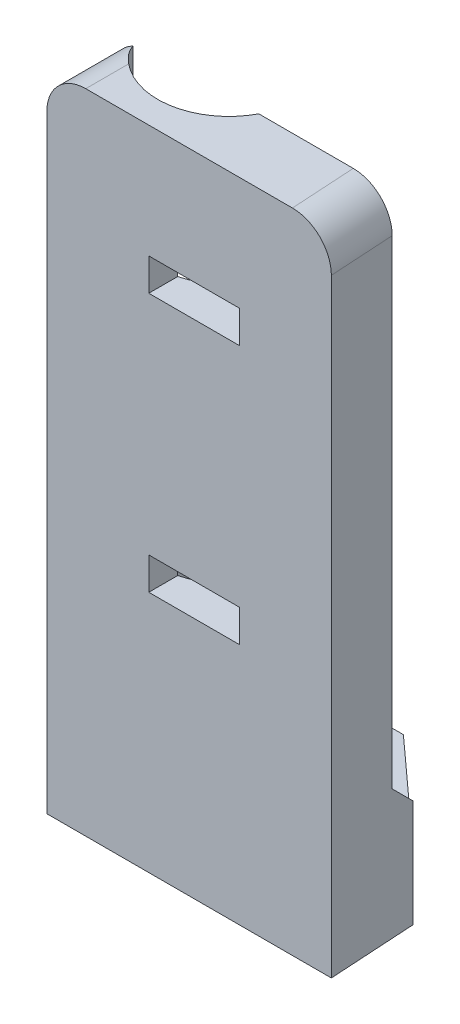
ISO-10303-21;
HEADER;
FILE_DESCRIPTION(('STEP AP214'),'2;1');
FILE_NAME('part.step','',(''),(''),'','','');
FILE_SCHEMA(('AUTOMOTIVE_DESIGN { 1 0 10303 214 1 1 1 1 }'));
ENDSEC;
DATA;
#1=APPLICATION_CONTEXT('core data for automotive mechanical design processes');
#2=APPLICATION_PROTOCOL_DEFINITION('international standard','automotive_design',2000,#1);
#3=PRODUCT_CONTEXT('',#1,'mechanical');
#4=PRODUCT('Part','Part','',(#3));
#5=PRODUCT_RELATED_PRODUCT_CATEGORY('part','',(#4));
#6=PRODUCT_DEFINITION_FORMATION('','',#4);
#7=PRODUCT_DEFINITION_CONTEXT('part definition',#1,'design');
#8=PRODUCT_DEFINITION('design','',#6,#7);
#9=PRODUCT_DEFINITION_SHAPE('','',#8);
#10=(LENGTH_UNIT() NAMED_UNIT(*) SI_UNIT(.MILLI.,.METRE.));
#11=(NAMED_UNIT(*) PLANE_ANGLE_UNIT() SI_UNIT($,.RADIAN.));
#12=(NAMED_UNIT(*) SI_UNIT($,.STERADIAN.) SOLID_ANGLE_UNIT());
#13=UNCERTAINTY_MEASURE_WITH_UNIT(LENGTH_MEASURE(1.E-05),#10,'distance_accuracy_value','');
#14=(GEOMETRIC_REPRESENTATION_CONTEXT(3) GLOBAL_UNCERTAINTY_ASSIGNED_CONTEXT((#13)) GLOBAL_UNIT_ASSIGNED_CONTEXT((#10,
#11,#12)) REPRESENTATION_CONTEXT('',''));
#15=CARTESIAN_POINT('',(0.,0.,0.));
#16=DIRECTION('',(0.,0.,1.));
#17=DIRECTION('',(1.,0.,0.));
#18=AXIS2_PLACEMENT_3D('',#15,#16,#17);
#19=CARTESIAN_POINT('',(0.,5.,0.));
#20=DIRECTION('',(0.,-1.,0.));
#21=DIRECTION('',(0.,0.,-1.));
#22=AXIS2_PLACEMENT_3D('',#19,#20,#21);
#23=PLANE('',#22);
#24=CARTESIAN_POINT('',(0.,5.,0.));
#25=DIRECTION('',(0.,1.,0.));
#26=DIRECTION('',(0.,0.,1.));
#27=AXIS2_PLACEMENT_3D('',#24,#25,#26);
#28=CIRCLE('',#27,5.5);
#29=CARTESIAN_POINT('',(4.92913785564979,5.,-2.44000000000004));
#30=VERTEX_POINT('',#29);
#31=CARTESIAN_POINT('',(-4.92913785564979,5.,-2.44000000000004));
#32=VERTEX_POINT('',#31);
#33=EDGE_CURVE('E274',#30,#32,#28,.T.);
#34=ORIENTED_EDGE('',*,*,#33,.F.);
#35=DIRECTION('',(1.,0.,0.));
#36=VECTOR('',#35,1.);
#37=CARTESIAN_POINT('',(15.1671456058184,5.,-2.44000000000004));
#38=LINE('',#37,#36);
#39=CARTESIAN_POINT('',(11.4482854878569,5.,-2.44000000000004));
#40=VERTEX_POINT('',#39);
#41=EDGE_CURVE('E349',#30,#40,#38,.T.);
#42=ORIENTED_EDGE('',*,*,#41,.T.);
#43=DIRECTION('',(0.740570076440376,0.,0.671979137980559));
#44=VECTOR('',#43,1.);
#45=CARTESIAN_POINT('',(5.32075950932338,5.,-8.));
#46=LINE('',#45,#44);
#47=CARTESIAN_POINT('',(6.97386903590619,5.,-6.5));
#48=VERTEX_POINT('',#47);
#49=EDGE_CURVE('E296',#48,#40,#46,.T.);
#50=ORIENTED_EDGE('',*,*,#49,.F.);
#51=DIRECTION('',(-1.,0.,0.));
#52=VECTOR('',#51,1.);
#53=CARTESIAN_POINT('',(0.,5.,-6.5));
#54=LINE('',#53,#52);
#55=CARTESIAN_POINT('',(0.,5.,-6.5));
#56=VERTEX_POINT('',#55);
#57=EDGE_CURVE('E288',#48,#56,#54,.T.);
#58=ORIENTED_EDGE('',*,*,#57,.T.);
#59=CARTESIAN_POINT('',(0.,5.,0.));
#60=DIRECTION('',(0.,-1.,0.));
#61=DIRECTION('',(0.,0.,-1.));
#62=AXIS2_PLACEMENT_3D('',#59,#60,#61);
#63=CIRCLE('',#62,6.50000000000001);
#64=CARTESIAN_POINT('',(-6.02464936739058,5.,-2.44000000000004));
#65=VERTEX_POINT('',#64);
#66=EDGE_CURVE('E341',#65,#56,#63,.T.);
#67=ORIENTED_EDGE('',*,*,#66,.F.);
#68=DIRECTION('',(1.,0.,0.));
#69=VECTOR('',#68,1.);
#70=CARTESIAN_POINT('',(-4.86789482219984,5.,-2.44000000000004));
#71=LINE('',#70,#69);
#72=EDGE_CURVE('E346',#65,#32,#71,.T.);
#73=ORIENTED_EDGE('',*,*,#72,.T.);
#74=EDGE_LOOP('',(#34,#42,#50,#58,#67,#73));
#75=FACE_BOUND('',#74,.T.);
#76=ADVANCED_FACE('F40',(#75),#23,.F.);
#77=CARTESIAN_POINT('',(-22.4690156650757,50.,7.56));
#78=DIRECTION('',(0.,0.,-1.));
#79=DIRECTION('',(-1.,0.,0.));
#80=AXIS2_PLACEMENT_3D('',#77,#78,#79);
#81=PLANE('',#80);
#82=DIRECTION('',(1.,0.,0.));
#83=VECTOR('',#82,1.);
#84=CARTESIAN_POINT('',(1.36789482219984,38.75,7.56));
#85=LINE('',#84,#83);
#86=CARTESIAN_POINT('',(1.36789482219984,38.75,7.56));
#87=VERTEX_POINT('',#86);
#88=CARTESIAN_POINT('',(8.36789482219984,38.75,7.56));
#89=VERTEX_POINT('',#88);
#90=EDGE_CURVE('E225',#87,#89,#85,.T.);
#91=ORIENTED_EDGE('',*,*,#90,.F.);
#92=DIRECTION('',(0.,-1.,0.));
#93=VECTOR('',#92,1.);
#94=CARTESIAN_POINT('',(1.36789482219984,41.25,7.56));
#95=LINE('',#94,#93);
#96=CARTESIAN_POINT('',(1.36789482219984,41.25,7.56));
#97=VERTEX_POINT('',#96);
#98=EDGE_CURVE('E56',#97,#87,#95,.T.);
#99=ORIENTED_EDGE('',*,*,#98,.F.);
#100=DIRECTION('',(-1.,0.,0.));
#101=VECTOR('',#100,1.);
#102=CARTESIAN_POINT('',(1.36789482219984,41.25,7.56));
#103=LINE('',#102,#101);
#104=CARTESIAN_POINT('',(8.36789482219984,41.25,7.56));
#105=VERTEX_POINT('',#104);
#106=EDGE_CURVE('E232',#105,#97,#103,.T.);
#107=ORIENTED_EDGE('',*,*,#106,.F.);
#108=DIRECTION('',(0.,1.,0.));
#109=VECTOR('',#108,1.);
#110=CARTESIAN_POINT('',(8.36789482219984,41.25,7.56));
#111=LINE('',#110,#109);
#112=EDGE_CURVE('E215',#89,#105,#111,.T.);
#113=ORIENTED_EDGE('',*,*,#112,.F.);
#114=EDGE_LOOP('',(#91,#99,#107,#113));
#115=FACE_BOUND('',#114,.T.);
#116=DIRECTION('',(0.,-1.,0.));
#117=VECTOR('',#116,1.);
#118=CARTESIAN_POINT('',(1.36789482220005,21.25,7.56));
#119=LINE('',#118,#117);
#120=CARTESIAN_POINT('',(1.36789482220005,21.25,7.56));
#121=VERTEX_POINT('',#120);
#122=CARTESIAN_POINT('',(1.36789482220005,18.75,7.56));
#123=VERTEX_POINT('',#122);
#124=EDGE_CURVE('E243',#121,#123,#119,.T.);
#125=ORIENTED_EDGE('',*,*,#124,.F.);
#126=DIRECTION('',(-1.,0.,0.));
#127=VECTOR('',#126,1.);
#128=CARTESIAN_POINT('',(1.36789482220005,21.25,7.56));
#129=LINE('',#128,#127);
#130=CARTESIAN_POINT('',(8.36789482220005,21.25,7.56));
#131=VERTEX_POINT('',#130);
#132=EDGE_CURVE('E64',#131,#121,#129,.T.);
#133=ORIENTED_EDGE('',*,*,#132,.F.);
#134=DIRECTION('',(0.,1.,0.));
#135=VECTOR('',#134,1.);
#136=CARTESIAN_POINT('',(8.36789482220005,21.25,7.56));
#137=LINE('',#136,#135);
#138=CARTESIAN_POINT('',(8.36789482220005,18.75,7.56));
#139=VERTEX_POINT('',#138);
#140=EDGE_CURVE('E249',#139,#131,#137,.T.);
#141=ORIENTED_EDGE('',*,*,#140,.F.);
#142=DIRECTION('',(1.,0.,0.));
#143=VECTOR('',#142,1.);
#144=CARTESIAN_POINT('',(1.36789482220005,18.75,7.56));
#145=LINE('',#144,#143);
#146=EDGE_CURVE('E246',#123,#139,#145,.T.);
#147=ORIENTED_EDGE('',*,*,#146,.F.);
#148=EDGE_LOOP('',(#125,#133,#141,#147));
#149=FACE_BOUND('',#148,.T.);
#150=DIRECTION('',(0.,1.,0.));
#151=VECTOR('',#150,1.);
#152=CARTESIAN_POINT('',(15.4690156650757,50.,7.56));
#153=LINE('',#152,#151);
#154=CARTESIAN_POINT('',(15.4690156650757,0.,7.56));
#155=VERTEX_POINT('',#154);
#156=CARTESIAN_POINT('',(15.4690156650757,47.,7.56));
#157=VERTEX_POINT('',#156);
#158=EDGE_CURVE('E330',#155,#157,#153,.T.);
#159=ORIENTED_EDGE('',*,*,#158,.T.);
#160=CARTESIAN_POINT('',(12.4635531063731,47.,7.56));
#161=DIRECTION('',(0.,0.,-1.));
#162=DIRECTION('',(-1.,0.,0.));
#163=AXIS2_PLACEMENT_3D('',#160,#161,#162);
#164=ELLIPSE('',#163,3.00546255870263,3.);
#165=CARTESIAN_POINT('',(12.4635531063731,50.,7.56));
#166=VERTEX_POINT('',#165);
#167=EDGE_CURVE('E385',#157,#166,#164,.F.);
#168=ORIENTED_EDGE('',*,*,#167,.T.);
#169=DIRECTION('',(1.,0.,0.));
#170=VECTOR('',#169,1.);
#171=CARTESIAN_POINT('',(-22.4690156650757,50.,7.56));
#172=LINE('',#171,#170);
#173=CARTESIAN_POINT('',(-3.5,50.,7.56));
#174=VERTEX_POINT('',#173);
#175=EDGE_CURVE('E318',#174,#166,#172,.T.);
#176=ORIENTED_EDGE('',*,*,#175,.F.);
#177=CARTESIAN_POINT('',(-3.5,47.,7.56));
#178=DIRECTION('',(0.,0.,-1.));
#179=DIRECTION('',(-1.,0.,0.));
#180=AXIS2_PLACEMENT_3D('',#177,#178,#179);
#181=CIRCLE('',#180,3.);
#182=CARTESIAN_POINT('',(-6.5,47.,7.56));
#183=VERTEX_POINT('',#182);
#184=EDGE_CURVE('E383',#174,#183,#181,.F.);
#185=ORIENTED_EDGE('',*,*,#184,.T.);
#186=DIRECTION('',(0.,1.,0.));
#187=VECTOR('',#186,1.);
#188=CARTESIAN_POINT('',(-6.5,50.,7.56));
#189=LINE('',#188,#187);
#190=CARTESIAN_POINT('',(-6.5,0.,7.56));
#191=VERTEX_POINT('',#190);
#192=EDGE_CURVE('E335',#191,#183,#189,.T.);
#193=ORIENTED_EDGE('',*,*,#192,.F.);
#194=DIRECTION('',(1.,0.,0.));
#195=VECTOR('',#194,1.);
#196=CARTESIAN_POINT('',(-22.4690156650757,0.,7.56));
#197=LINE('',#196,#195);
#198=EDGE_CURVE('E317',#191,#155,#197,.T.);
#199=ORIENTED_EDGE('',*,*,#198,.T.);
#200=EDGE_LOOP('',(#159,#168,#176,#185,#193,#199));
#201=FACE_BOUND('',#200,.T.);
#202=ADVANCED_FACE('F229',(#115,#149,#201),#81,.F.);
#203=CARTESIAN_POINT('',(5.32075950932338,50.,-8.));
#204=DIRECTION('',(-0.671979137980559,0.,0.740570076440376));
#205=DIRECTION('',(0.740570076440376,0.,0.671979137980559));
#206=AXIS2_PLACEMENT_3D('',#203,#204,#205);
#207=PLANE('',#206);
#208=DIRECTION('',(0.,-1.,0.));
#209=VECTOR('',#208,1.);
#210=CARTESIAN_POINT('',(6.97386903590619,50.,-6.5));
#211=LINE('',#210,#209);
#212=CARTESIAN_POINT('',(6.97386903590619,0.,-6.5));
#213=VERTEX_POINT('',#212);
#214=EDGE_CURVE('E333',#48,#213,#211,.T.);
#215=ORIENTED_EDGE('',*,*,#214,.F.);
#216=ORIENTED_EDGE('',*,*,#49,.T.);
#217=DIRECTION('',(-0.614680262385864,-0.557749125966702,-0.557749125966707));
#218=VECTOR('',#217,1.);
#219=CARTESIAN_POINT('',(22.6546173963513,15.1684114648404,7.7284114648404));
#220=LINE('',#219,#218);
#221=CARTESIAN_POINT('',(15.0633149006719,8.2802086201944,0.840208620194387));
#222=VERTEX_POINT('',#221);
#223=EDGE_CURVE('E356',#40,#222,#220,.F.);
#224=ORIENTED_EDGE('',*,*,#223,.T.);
#225=DIRECTION('',(0.,-1.,0.));
#226=VECTOR('',#225,1.);
#227=CARTESIAN_POINT('',(15.0633149006719,50.,0.840208620194387));
#228=LINE('',#227,#226);
#229=CARTESIAN_POINT('',(15.0633149006719,0.,0.840208620194387));
#230=VERTEX_POINT('',#229);
#231=EDGE_CURVE('E321',#222,#230,#228,.T.);
#232=ORIENTED_EDGE('',*,*,#231,.T.);
#233=DIRECTION('',(-0.740570076440376,0.,-0.671979137980559));
#234=VECTOR('',#233,1.);
#235=CARTESIAN_POINT('',(5.32075950932338,0.,-8.));
#236=LINE('',#235,#234);
#237=EDGE_CURVE('E322',#230,#213,#236,.T.);
#238=ORIENTED_EDGE('',*,*,#237,.T.);
#239=EDGE_LOOP('',(#215,#216,#224,#232,#238));
#240=FACE_BOUND('',#239,.T.);
#241=ADVANCED_FACE('F421',(#240),#207,.F.);
#242=CARTESIAN_POINT('',(0.,50.,0.));
#243=DIRECTION('',(0.,-1.,0.));
#244=DIRECTION('',(0.,0.,-1.));
#245=AXIS2_PLACEMENT_3D('',#242,#243,#244);
#246=PLANE('',#245);
#247=ORIENTED_EDGE('',*,*,#175,.T.);
#248=DIRECTION('',(0.0602642794633902,0.,0.998182456578334));
#249=VECTOR('',#248,1.);
#250=CARTESIAN_POINT('',(12.1725982360834,50.,2.74079283839017));
#251=LINE('',#250,#249);
#252=CARTESIAN_POINT('',(12.1616830471157,50.,2.56));
#253=VERTEX_POINT('',#252);
#254=EDGE_CURVE('E376',#166,#253,#251,.F.);
#255=ORIENTED_EDGE('',*,*,#254,.T.);
#256=DIRECTION('',(1.,0.,0.));
#257=VECTOR('',#256,1.);
#258=CARTESIAN_POINT('',(4.86789482219984,50.,2.56));
#259=LINE('',#258,#257);
#260=CARTESIAN_POINT('',(4.86789482219984,50.,2.56));
#261=VERTEX_POINT('',#260);
#262=EDGE_CURVE('E278',#261,#253,#259,.T.);
#263=ORIENTED_EDGE('',*,*,#262,.F.);
#264=CARTESIAN_POINT('',(0.,50.,0.));
#265=DIRECTION('',(0.,1.,0.));
#266=DIRECTION('',(0.,0.,1.));
#267=AXIS2_PLACEMENT_3D('',#264,#265,#266);
#268=CIRCLE('',#267,5.5);
#269=CARTESIAN_POINT('',(-3.5,50.,4.24264068711928));
#270=VERTEX_POINT('',#269);
#271=EDGE_CURVE('E311',#270,#261,#268,.T.);
#272=ORIENTED_EDGE('',*,*,#271,.F.);
#273=DIRECTION('',(0.,0.,1.));
#274=VECTOR('',#273,1.);
#275=CARTESIAN_POINT('',(-3.5,50.,7.56));
#276=LINE('',#275,#274);
#277=EDGE_CURVE('E373',#270,#174,#276,.T.);
#278=ORIENTED_EDGE('',*,*,#277,.T.);
#279=EDGE_LOOP('',(#247,#255,#263,#272,#278));
#280=FACE_BOUND('',#279,.T.);
#281=ADVANCED_FACE('F418',(#280),#246,.F.);
#282=CARTESIAN_POINT('',(0.,0.,0.));
#283=DIRECTION('',(0.,-1.,0.));
#284=DIRECTION('',(0.,0.,-1.));
#285=AXIS2_PLACEMENT_3D('',#282,#283,#284);
#286=PLANE('',#285);
#287=ORIENTED_EDGE('',*,*,#198,.F.);
#288=DIRECTION('',(0.,0.,-1.));
#289=VECTOR('',#288,1.);
#290=CARTESIAN_POINT('',(-6.5,0.,0.));
#291=LINE('',#290,#289);
#292=CARTESIAN_POINT('',(-6.5,0.,0.));
#293=VERTEX_POINT('',#292);
#294=EDGE_CURVE('E308',#191,#293,#291,.T.);
#295=ORIENTED_EDGE('',*,*,#294,.T.);
#296=CARTESIAN_POINT('',(0.,0.,0.));
#297=DIRECTION('',(0.,-1.,0.));
#298=DIRECTION('',(0.,0.,-1.));
#299=AXIS2_PLACEMENT_3D('',#296,#297,#298);
#300=CIRCLE('',#299,6.50000000000001);
#301=CARTESIAN_POINT('',(0.,0.,-6.5));
#302=VERTEX_POINT('',#301);
#303=EDGE_CURVE('E338',#302,#293,#300,.F.);
#304=ORIENTED_EDGE('',*,*,#303,.F.);
#305=DIRECTION('',(1.,0.,0.));
#306=VECTOR('',#305,1.);
#307=CARTESIAN_POINT('',(0.,0.,-6.5));
#308=LINE('',#307,#306);
#309=EDGE_CURVE('E304',#302,#213,#308,.T.);
#310=ORIENTED_EDGE('',*,*,#309,.T.);
#311=ORIENTED_EDGE('',*,*,#237,.F.);
#312=DIRECTION('',(-0.0602642794633902,0.,-0.998182456578334));
#313=VECTOR('',#312,1.);
#314=CARTESIAN_POINT('',(14.9580656674088,0.,-0.903078433879208));
#315=LINE('',#314,#313);
#316=EDGE_CURVE('E327',#230,#155,#315,.F.);
#317=ORIENTED_EDGE('',*,*,#316,.T.);
#318=EDGE_LOOP('',(#287,#295,#304,#310,#311,#317));
#319=FACE_BOUND('',#318,.T.);
#320=CARTESIAN_POINT('',(0.,0.,0.));
#321=DIRECTION('',(0.,1.,0.));
#322=DIRECTION('',(0.,0.,1.));
#323=AXIS2_PLACEMENT_3D('',#320,#321,#322);
#324=CIRCLE('',#323,3.25);
#325=CARTESIAN_POINT('',(0.,0.,3.25));
#326=VERTEX_POINT('',#325);
#327=EDGE_CURVE('E314',#326,#326,#324,.T.);
#328=ORIENTED_EDGE('',*,*,#327,.T.);
#329=EDGE_LOOP('',(#328));
#330=FACE_BOUND('',#329,.T.);
#331=ADVANCED_FACE('F416',(#319,#330),#286,.T.);
#332=CARTESIAN_POINT('',(0.,50.,0.));
#333=DIRECTION('',(0.,-1.,0.));
#334=DIRECTION('',(0.,0.,-1.));
#335=AXIS2_PLACEMENT_3D('',#332,#333,#334);
#336=CYLINDRICAL_SURFACE('',#335,3.25);
#337=ORIENTED_EDGE('',*,*,#327,.F.);
#338=EDGE_LOOP('',(#337));
#339=FACE_BOUND('',#338,.T.);
#340=CARTESIAN_POINT('',(0.,16.,0.));
#341=DIRECTION('',(0.,1.,0.));
#342=DIRECTION('',(0.,0.,1.));
#343=AXIS2_PLACEMENT_3D('',#340,#341,#342);
#344=CIRCLE('',#343,3.25);
#345=CARTESIAN_POINT('',(0.,16.,3.25));
#346=VERTEX_POINT('',#345);
#347=EDGE_CURVE('E271',#346,#346,#344,.T.);
#348=ORIENTED_EDGE('',*,*,#347,.T.);
#349=EDGE_LOOP('',(#348));
#350=FACE_BOUND('',#349,.T.);
#351=ADVANCED_FACE('F413',(#339,#350),#336,.F.);
#352=CARTESIAN_POINT('',(15.0633149006719,50.,0.840208620194387));
#353=DIRECTION('',(-0.998182456578334,0.,0.0602642794633902));
#354=DIRECTION('',(0.,-1.,0.));
#355=AXIS2_PLACEMENT_3D('',#352,#353,#354);
#356=PLANE('',#355);
#357=DIRECTION('',(0.,1.,0.));
#358=VECTOR('',#357,1.);
#359=CARTESIAN_POINT('',(15.1671456058184,50.,2.56));
#360=LINE('',#359,#358);
#361=CARTESIAN_POINT('',(15.1671456058184,47.,2.56));
#362=VERTEX_POINT('',#361);
#363=CARTESIAN_POINT('',(15.1671456058184,9.99999999999999,2.56));
#364=VERTEX_POINT('',#363);
#365=EDGE_CURVE('E299',#362,#364,#360,.F.);
#366=ORIENTED_EDGE('',*,*,#365,.F.);
#367=DIRECTION('',(-0.0602642794633902,0.,-0.998182456578334));
#368=VECTOR('',#367,1.);
#369=CARTESIAN_POINT('',(15.4690156650757,47.,7.56));
#370=LINE('',#369,#368);
#371=EDGE_CURVE('E381',#362,#157,#370,.F.);
#372=ORIENTED_EDGE('',*,*,#371,.T.);
#373=ORIENTED_EDGE('',*,*,#158,.F.);
#374=ORIENTED_EDGE('',*,*,#316,.F.);
#375=ORIENTED_EDGE('',*,*,#231,.F.);
#376=DIRECTION('',(0.0426520239962568,0.706463305787715,0.706463305787722));
#377=VECTOR('',#376,1.);
#378=CARTESIAN_POINT('',(14.8382327093688,4.55207818127485,-2.8879218187252));
#379=LINE('',#378,#377);
#380=EDGE_CURVE('E359',#222,#364,#379,.T.);
#381=ORIENTED_EDGE('',*,*,#380,.T.);
#382=EDGE_LOOP('',(#366,#372,#373,#374,#375,#381));
#383=FACE_BOUND('',#382,.T.);
#384=ADVANCED_FACE('F407',(#383),#356,.F.);
#385=CARTESIAN_POINT('',(0.,-15.556349186104,0.));
#386=DIRECTION('',(0.,1.,0.));
#387=DIRECTION('',(0.,0.,1.));
#388=AXIS2_PLACEMENT_3D('',#385,#386,#387);
#389=CYLINDRICAL_SURFACE('',#388,5.5);
#390=DIRECTION('',(0.,1.,0.));
#391=VECTOR('',#390,1.);
#392=CARTESIAN_POINT('',(4.86789482219984,-27.0000526923064,2.56));
#393=LINE('',#392,#391);
#394=CARTESIAN_POINT('',(4.86789482219984,41.25,2.56));
#395=VERTEX_POINT('',#394);
#396=EDGE_CURVE('E284',#395,#261,#393,.T.);
#397=ORIENTED_EDGE('',*,*,#396,.F.);
#398=CARTESIAN_POINT('',(0.,41.25,0.));
#399=DIRECTION('',(0.,1.,0.));
#400=DIRECTION('',(0.,0.,1.));
#401=AXIS2_PLACEMENT_3D('',#398,#399,#400);
#402=CIRCLE('',#401,5.5);
#403=CARTESIAN_POINT('',(1.36789482219984,41.25,5.32718159587214));
#404=VERTEX_POINT('',#403);
#405=EDGE_CURVE('E268',#395,#404,#402,.F.);
#406=ORIENTED_EDGE('',*,*,#405,.T.);
#407=DIRECTION('',(0.,1.,0.));
#408=VECTOR('',#407,1.);
#409=CARTESIAN_POINT('',(1.36789482219986,-15.556349186104,5.32718159587214));
#410=LINE('',#409,#408);
#411=CARTESIAN_POINT('',(1.36789482219984,38.75,5.32718159587214));
#412=VERTEX_POINT('',#411);
#413=EDGE_CURVE('E12',#404,#412,#410,.F.);
#414=ORIENTED_EDGE('',*,*,#413,.T.);
#415=CARTESIAN_POINT('',(0.,38.75,0.));
#416=DIRECTION('',(0.,-1.,0.));
#417=DIRECTION('',(0.,0.,-1.));
#418=AXIS2_PLACEMENT_3D('',#415,#416,#417);
#419=CIRCLE('',#418,5.5);
#420=CARTESIAN_POINT('',(4.86789482219984,38.75,2.56));
#421=VERTEX_POINT('',#420);
#422=EDGE_CURVE('E265',#412,#421,#419,.F.);
#423=ORIENTED_EDGE('',*,*,#422,.T.);
#424=CARTESIAN_POINT('',(4.86789482219984,21.25,2.56));
#425=VERTEX_POINT('',#424);
#426=EDGE_CURVE('E479',#425,#421,#393,.T.);
#427=ORIENTED_EDGE('',*,*,#426,.F.);
#428=CARTESIAN_POINT('',(0.,21.25,0.));
#429=DIRECTION('',(0.,1.,0.));
#430=DIRECTION('',(0.,0.,1.));
#431=AXIS2_PLACEMENT_3D('',#428,#429,#430);
#432=CIRCLE('',#431,5.5);
#433=CARTESIAN_POINT('',(1.36789482220005,21.25,5.32718159587208));
#434=VERTEX_POINT('',#433);
#435=EDGE_CURVE('E262',#425,#434,#432,.F.);
#436=ORIENTED_EDGE('',*,*,#435,.T.);
#437=DIRECTION('',(0.,1.,0.));
#438=VECTOR('',#437,1.);
#439=CARTESIAN_POINT('',(1.36789482220006,-15.556349186104,5.32718159587209));
#440=LINE('',#439,#438);
#441=CARTESIAN_POINT('',(1.36789482220005,18.75,5.32718159587208));
#442=VERTEX_POINT('',#441);
#443=EDGE_CURVE('E49',#434,#442,#440,.F.);
#444=ORIENTED_EDGE('',*,*,#443,.T.);
#445=CARTESIAN_POINT('',(0.,18.75,0.));
#446=DIRECTION('',(0.,-1.,0.));
#447=DIRECTION('',(0.,0.,-1.));
#448=AXIS2_PLACEMENT_3D('',#445,#446,#447);
#449=CIRCLE('',#448,5.5);
#450=CARTESIAN_POINT('',(4.86789482219984,18.75,2.56));
#451=VERTEX_POINT('',#450);
#452=EDGE_CURVE('E239',#442,#451,#449,.F.);
#453=ORIENTED_EDGE('',*,*,#452,.T.);
#454=CARTESIAN_POINT('',(4.86789482219984,16.,2.56));
#455=VERTEX_POINT('',#454);
#456=EDGE_CURVE('E293',#455,#451,#393,.T.);
#457=ORIENTED_EDGE('',*,*,#456,.F.);
#458=CARTESIAN_POINT('',(0.,16.,0.));
#459=DIRECTION('',(0.,1.,0.));
#460=DIRECTION('',(0.,0.,1.));
#461=AXIS2_PLACEMENT_3D('',#458,#459,#460);
#462=CIRCLE('',#461,5.5);
#463=CARTESIAN_POINT('',(-4.86789482219984,16.,2.56));
#464=VERTEX_POINT('',#463);
#465=EDGE_CURVE('E279',#464,#455,#462,.T.);
#466=ORIENTED_EDGE('',*,*,#465,.F.);
#467=DIRECTION('',(0.,1.,0.));
#468=VECTOR('',#467,1.);
#469=CARTESIAN_POINT('',(-4.86789482219984,-27.0000526923064,2.56));
#470=LINE('',#469,#468);
#471=CARTESIAN_POINT('',(-4.86789482219984,49.6699932126129,2.56));
#472=VERTEX_POINT('',#471);
#473=EDGE_CURVE('E289',#464,#472,#470,.T.);
#474=ORIENTED_EDGE('',*,*,#473,.T.);
#475=CARTESIAN_POINT('',(-4.86789482219984,49.6699932126129,2.56));
#476=CARTESIAN_POINT('',(-4.81001281115621,49.6996372383301,2.67001908267944));
#477=CARTESIAN_POINT('',(-4.74841065562674,49.7288291876159,2.77813710862384));
#478=CARTESIAN_POINT('',(-4.61761712121786,49.7849637569741,2.99053032643147));
#479=CARTESIAN_POINT('',(-4.54841390009771,49.8119027486319,3.09479917385239));
#480=CARTESIAN_POINT('',(-4.33241325172603,49.886162664514,3.39713838700284));
#481=CARTESIAN_POINT('',(-4.17488566536807,49.9282331416977,3.5891975536215));
#482=CARTESIAN_POINT('',(-3.92577605461678,49.9706944341158,3.85374625409529));
#483=CARTESIAN_POINT('',(-3.84468799903182,49.9813183072902,3.93465582456891));
#484=CARTESIAN_POINT('',(-3.67658093890007,49.995995389604,4.09220625191814));
#485=CARTESIAN_POINT('',(-3.58951647701177,49.999990636361,4.1688038524149));
#486=CARTESIAN_POINT('',(-3.5,50.,4.24264068711928));
#487=B_SPLINE_CURVE_WITH_KNOTS('',3,(#475,#476,#477,#478,#479,#480,#481,#482,#483,#484,#485,
#486),.UNSPECIFIED.,.F.,.F.,(4,2,2,2,2,4),(0.,0.383207720744879,0.767021171471671,
1.51917460073373,1.8639442741787,2.2117131112596),.UNSPECIFIED.);
#488=EDGE_CURVE('E392',#472,#270,#487,.T.);
#489=ORIENTED_EDGE('',*,*,#488,.T.);
#490=ORIENTED_EDGE('',*,*,#271,.T.);
#491=EDGE_LOOP('',(#397,#406,#414,#423,#427,#436,#444,#453,#457,#466,#474,#489,#490));
#492=FACE_BOUND('',#491,.T.);
#493=ADVANCED_FACE('F401',(#492),#389,.F.);
#494=CARTESIAN_POINT('',(-6.5,-1.2E-05,0.));
#495=DIRECTION('',(-1.,0.,0.));
#496=DIRECTION('',(0.,0.,1.));
#497=AXIS2_PLACEMENT_3D('',#494,#495,#496);
#498=PLANE('',#497);
#499=ORIENTED_EDGE('',*,*,#192,.T.);
#500=DIRECTION('',(0.,0.,1.));
#501=VECTOR('',#500,1.);
#502=CARTESIAN_POINT('',(-6.5,47.,2.56));
#503=LINE('',#502,#501);
#504=CARTESIAN_POINT('',(-6.5,47.,2.56));
#505=VERTEX_POINT('',#504);
#506=EDGE_CURVE('E387',#183,#505,#503,.F.);
#507=ORIENTED_EDGE('',*,*,#506,.T.);
#508=DIRECTION('',(0.,1.,0.));
#509=VECTOR('',#508,1.);
#510=CARTESIAN_POINT('',(-6.5,-1.2E-05,2.56));
#511=LINE('',#510,#509);
#512=CARTESIAN_POINT('',(-6.5,9.99999999999999,2.56));
#513=VERTEX_POINT('',#512);
#514=EDGE_CURVE('E343',#513,#505,#511,.T.);
#515=ORIENTED_EDGE('',*,*,#514,.F.);
#516=DIRECTION('',(0.,0.707106781186545,0.70710678118655));
#517=VECTOR('',#516,1.);
#518=CARTESIAN_POINT('',(-6.5,5.,-2.44000000000004));
#519=LINE('',#518,#517);
#520=CARTESIAN_POINT('',(-6.5,7.44000000000003,0.));
#521=VERTEX_POINT('',#520);
#522=EDGE_CURVE('E368',#513,#521,#519,.F.);
#523=ORIENTED_EDGE('',*,*,#522,.T.);
#524=DIRECTION('',(0.,-1.,0.));
#525=VECTOR('',#524,1.);
#526=CARTESIAN_POINT('',(-6.5,50.,0.));
#527=LINE('',#526,#525);
#528=EDGE_CURVE('E301',#521,#293,#527,.T.);
#529=ORIENTED_EDGE('',*,*,#528,.T.);
#530=ORIENTED_EDGE('',*,*,#294,.F.);
#531=EDGE_LOOP('',(#499,#507,#515,#523,#529,#530));
#532=FACE_BOUND('',#531,.T.);
#533=ADVANCED_FACE('F406',(#532),#498,.T.);
#534=CARTESIAN_POINT('',(0.,-1.2E-05,-6.5));
#535=DIRECTION('',(0.,0.,-1.));
#536=DIRECTION('',(-1.,0.,0.));
#537=AXIS2_PLACEMENT_3D('',#534,#535,#536);
#538=PLANE('',#537);
#539=ORIENTED_EDGE('',*,*,#57,.F.);
#540=ORIENTED_EDGE('',*,*,#214,.T.);
#541=ORIENTED_EDGE('',*,*,#309,.F.);
#542=DIRECTION('',(0.,-1.,0.));
#543=VECTOR('',#542,1.);
#544=CARTESIAN_POINT('',(0.,50.,-6.5));
#545=LINE('',#544,#543);
#546=EDGE_CURVE('E302',#56,#302,#545,.T.);
#547=ORIENTED_EDGE('',*,*,#546,.F.);
#548=EDGE_LOOP('',(#539,#540,#541,#547));
#549=FACE_BOUND('',#548,.T.);
#550=ADVANCED_FACE('F495',(#549),#538,.T.);
#551=CARTESIAN_POINT('',(0.,50.,0.));
#552=DIRECTION('',(0.,-1.,0.));
#553=DIRECTION('',(0.,0.,-1.));
#554=AXIS2_PLACEMENT_3D('',#551,#552,#553);
#555=CYLINDRICAL_SURFACE('',#554,6.50000000000001);
#556=ORIENTED_EDGE('',*,*,#528,.F.);
#557=CARTESIAN_POINT('',(0.,7.44000000000002,0.));
#558=DIRECTION('',(0.,0.70710678118655,-0.707106781186545));
#559=DIRECTION('',(0.,-0.707106781186545,-0.70710678118655));
#560=AXIS2_PLACEMENT_3D('',#557,#558,#559);
#561=ELLIPSE('',#560,9.19238815542509,6.50000000000001);
#562=EDGE_CURVE('E371',#521,#65,#561,.F.);
#563=ORIENTED_EDGE('',*,*,#562,.T.);
#564=ORIENTED_EDGE('',*,*,#66,.T.);
#565=ORIENTED_EDGE('',*,*,#546,.T.);
#566=ORIENTED_EDGE('',*,*,#303,.T.);
#567=EDGE_LOOP('',(#556,#563,#564,#565,#566));
#568=FACE_BOUND('',#567,.T.);
#569=ADVANCED_FACE('F489',(#568),#555,.T.);
#570=CARTESIAN_POINT('',(4.86789482219984,-27.0000526923064,2.56));
#571=DIRECTION('',(0.,0.,1.));
#572=DIRECTION('',(1.,0.,0.));
#573=AXIS2_PLACEMENT_3D('',#570,#571,#572);
#574=PLANE('',#573);
#575=DIRECTION('',(0.,1.,0.));
#576=VECTOR('',#575,1.);
#577=CARTESIAN_POINT('',(8.36789482219984,-27.0000526923064,2.56));
#578=LINE('',#577,#576);
#579=CARTESIAN_POINT('',(8.36789482219984,38.75,2.56));
#580=VERTEX_POINT('',#579);
#581=CARTESIAN_POINT('',(8.36789482219984,41.25,2.56));
#582=VERTEX_POINT('',#581);
#583=EDGE_CURVE('E218',#580,#582,#578,.T.);
#584=ORIENTED_EDGE('',*,*,#583,.T.);
#585=DIRECTION('',(-1.,0.,0.));
#586=VECTOR('',#585,1.);
#587=CARTESIAN_POINT('',(4.86789482219984,41.25,2.56));
#588=LINE('',#587,#586);
#589=EDGE_CURVE('E478',#582,#395,#588,.T.);
#590=ORIENTED_EDGE('',*,*,#589,.T.);
#591=ORIENTED_EDGE('',*,*,#396,.T.);
#592=ORIENTED_EDGE('',*,*,#262,.T.);
#593=CARTESIAN_POINT('',(12.1616830471157,47.,2.56));
#594=DIRECTION('',(0.,0.,1.));
#595=DIRECTION('',(-1.,0.,0.));
#596=AXIS2_PLACEMENT_3D('',#593,#594,#595);
#597=ELLIPSE('',#596,3.00546255870263,3.);
#598=EDGE_CURVE('E379',#253,#362,#597,.F.);
#599=ORIENTED_EDGE('',*,*,#598,.T.);
#600=ORIENTED_EDGE('',*,*,#365,.T.);
#601=DIRECTION('',(-1.,0.,0.));
#602=VECTOR('',#601,1.);
#603=CARTESIAN_POINT('',(4.86789482219984,9.99999999999999,2.56));
#604=LINE('',#603,#602);
#605=CARTESIAN_POINT('',(4.86789482219984,9.99999999999998,2.56));
#606=VERTEX_POINT('',#605);
#607=EDGE_CURVE('E352',#364,#606,#604,.T.);
#608=ORIENTED_EDGE('',*,*,#607,.T.);
#609=EDGE_CURVE('E290',#606,#455,#393,.T.);
#610=ORIENTED_EDGE('',*,*,#609,.T.);
#611=ORIENTED_EDGE('',*,*,#456,.T.);
#612=DIRECTION('',(1.,0.,0.));
#613=VECTOR('',#612,1.);
#614=CARTESIAN_POINT('',(4.86789482219984,18.75,2.56));
#615=LINE('',#614,#613);
#616=CARTESIAN_POINT('',(8.36789482220005,18.75,2.56));
#617=VERTEX_POINT('',#616);
#618=EDGE_CURVE('E399',#451,#617,#615,.T.);
#619=ORIENTED_EDGE('',*,*,#618,.T.);
#620=DIRECTION('',(0.,1.,0.));
#621=VECTOR('',#620,1.);
#622=CARTESIAN_POINT('',(8.36789482220005,-27.0000526923064,2.56));
#623=LINE('',#622,#621);
#624=CARTESIAN_POINT('',(8.36789482220005,21.25,2.56));
#625=VERTEX_POINT('',#624);
#626=EDGE_CURVE('E719',#617,#625,#623,.T.);
#627=ORIENTED_EDGE('',*,*,#626,.T.);
#628=DIRECTION('',(-1.,0.,0.));
#629=VECTOR('',#628,1.);
#630=CARTESIAN_POINT('',(4.86789482219984,21.25,2.56));
#631=LINE('',#630,#629);
#632=EDGE_CURVE('E708',#625,#425,#631,.T.);
#633=ORIENTED_EDGE('',*,*,#632,.T.);
#634=ORIENTED_EDGE('',*,*,#426,.T.);
#635=DIRECTION('',(1.,0.,0.));
#636=VECTOR('',#635,1.);
#637=CARTESIAN_POINT('',(4.86789482219984,38.75,2.56));
#638=LINE('',#637,#636);
#639=EDGE_CURVE('E706',#421,#580,#638,.T.);
#640=ORIENTED_EDGE('',*,*,#639,.T.);
#641=EDGE_LOOP('',(#584,#590,#591,#592,#599,#600,#608,#610,#611,#619,#627,#633,#634,#640));
#642=FACE_BOUND('',#641,.T.);
#643=ADVANCED_FACE('F474',(#642),#574,.F.);
#644=CARTESIAN_POINT('',(-4.86789482219984,-27.0000526923064,2.56));
#645=DIRECTION('',(0.,0.,1.));
#646=DIRECTION('',(1.,0.,0.));
#647=AXIS2_PLACEMENT_3D('',#644,#645,#646);
#648=PLANE('',#647);
#649=ORIENTED_EDGE('',*,*,#514,.T.);
#650=CARTESIAN_POINT('',(-3.5,47.,2.56));
#651=DIRECTION('',(0.,0.,1.));
#652=DIRECTION('',(1.,0.,0.));
#653=AXIS2_PLACEMENT_3D('',#650,#651,#652);
#654=CIRCLE('',#653,3.);
#655=EDGE_CURVE('E389',#505,#472,#654,.F.);
#656=ORIENTED_EDGE('',*,*,#655,.T.);
#657=ORIENTED_EDGE('',*,*,#473,.F.);
#658=CARTESIAN_POINT('',(-4.86789482219984,9.99999999999999,2.56));
#659=VERTEX_POINT('',#658);
#660=EDGE_CURVE('E285',#659,#464,#470,.T.);
#661=ORIENTED_EDGE('',*,*,#660,.F.);
#662=DIRECTION('',(-1.,0.,0.));
#663=VECTOR('',#662,1.);
#664=CARTESIAN_POINT('',(-6.5,9.99999999999999,2.56));
#665=LINE('',#664,#663);
#666=EDGE_CURVE('E354',#659,#513,#665,.T.);
#667=ORIENTED_EDGE('',*,*,#666,.T.);
#668=EDGE_LOOP('',(#649,#656,#657,#661,#667));
#669=FACE_BOUND('',#668,.T.);
#670=ADVANCED_FACE('F438',(#669),#648,.F.);
#671=CARTESIAN_POINT('',(0.,5.,-2.44000000000004));
#672=DIRECTION('',(0.,0.707106781186551,-0.707106781186544));
#673=DIRECTION('',(-1.,0.,0.));
#674=AXIS2_PLACEMENT_3D('',#671,#672,#673);
#675=PLANE('',#674);
#676=CARTESIAN_POINT('',(0.,7.44000000000002,0.));
#677=DIRECTION('',(0.,0.707106781186551,-0.707106781186544));
#678=DIRECTION('',(0.,0.707106781186544,0.707106781186551));
#679=AXIS2_PLACEMENT_3D('',#676,#677,#678);
#680=ELLIPSE('',#679,7.77817459305199,5.5);
#681=EDGE_CURVE('E362',#606,#30,#680,.T.);
#682=ORIENTED_EDGE('',*,*,#681,.F.);
#683=ORIENTED_EDGE('',*,*,#607,.F.);
#684=ORIENTED_EDGE('',*,*,#380,.F.);
#685=ORIENTED_EDGE('',*,*,#223,.F.);
#686=ORIENTED_EDGE('',*,*,#41,.F.);
#687=EDGE_LOOP('',(#682,#683,#684,#685,#686));
#688=FACE_BOUND('',#687,.T.);
#689=ADVANCED_FACE('F434',(#688),#675,.T.);
#690=CARTESIAN_POINT('',(0.,5.,-2.44000000000004));
#691=DIRECTION('',(0.,0.70710678118655,-0.707106781186545));
#692=DIRECTION('',(-1.,0.,0.));
#693=AXIS2_PLACEMENT_3D('',#690,#691,#692);
#694=PLANE('',#693);
#695=ORIENTED_EDGE('',*,*,#522,.F.);
#696=ORIENTED_EDGE('',*,*,#666,.F.);
#697=CARTESIAN_POINT('',(0.,7.44000000000002,0.));
#698=DIRECTION('',(0.,0.70710678118655,-0.707106781186545));
#699=DIRECTION('',(0.,0.707106781186545,0.70710678118655));
#700=AXIS2_PLACEMENT_3D('',#697,#698,#699);
#701=ELLIPSE('',#700,7.77817459305199,5.5);
#702=EDGE_CURVE('E365',#32,#659,#701,.T.);
#703=ORIENTED_EDGE('',*,*,#702,.F.);
#704=ORIENTED_EDGE('',*,*,#72,.F.);
#705=ORIENTED_EDGE('',*,*,#562,.F.);
#706=EDGE_LOOP('',(#695,#696,#703,#704,#705));
#707=FACE_BOUND('',#706,.T.);
#708=ADVANCED_FACE('F437',(#707),#694,.T.);
#709=CARTESIAN_POINT('',(11.9635182976738,47.,-0.722285595489038));
#710=DIRECTION('',(-0.0602642794633902,0.,-0.998182456578334));
#711=DIRECTION('',(-0.998182456578334,0.,0.0602642794633902));
#712=AXIS2_PLACEMENT_3D('',#709,#710,#711);
#713=CYLINDRICAL_SURFACE('',#712,3.);
#714=ORIENTED_EDGE('',*,*,#167,.F.);
#715=ORIENTED_EDGE('',*,*,#371,.F.);
#716=ORIENTED_EDGE('',*,*,#598,.F.);
#717=ORIENTED_EDGE('',*,*,#254,.F.);
#718=EDGE_LOOP('',(#714,#715,#716,#717));
#719=FACE_BOUND('',#718,.T.);
#720=ADVANCED_FACE('F441',(#719),#713,.T.);
#721=CARTESIAN_POINT('',(-3.5,47.,0.));
#722=DIRECTION('',(0.,0.,-1.));
#723=DIRECTION('',(-1.,0.,0.));
#724=AXIS2_PLACEMENT_3D('',#721,#722,#723);
#725=CYLINDRICAL_SURFACE('',#724,3.);
#726=ORIENTED_EDGE('',*,*,#655,.F.);
#727=ORIENTED_EDGE('',*,*,#506,.F.);
#728=ORIENTED_EDGE('',*,*,#184,.F.);
#729=ORIENTED_EDGE('',*,*,#277,.F.);
#730=ORIENTED_EDGE('',*,*,#488,.F.);
#731=EDGE_LOOP('',(#726,#727,#728,#729,#730));
#732=FACE_BOUND('',#731,.T.);
#733=ADVANCED_FACE('F42',(#732),#725,.T.);
#734=CARTESIAN_POINT('',(0.,16.,0.));
#735=DIRECTION('',(0.,-1.,0.));
#736=DIRECTION('',(0.,0.,-1.));
#737=AXIS2_PLACEMENT_3D('',#734,#735,#736);
#738=CYLINDRICAL_SURFACE('',#737,5.5);
#739=EDGE_CURVE('E275',#455,#464,#462,.T.);
#740=ORIENTED_EDGE('',*,*,#739,.F.);
#741=ORIENTED_EDGE('',*,*,#609,.F.);
#742=ORIENTED_EDGE('',*,*,#681,.T.);
#743=ORIENTED_EDGE('',*,*,#33,.T.);
#744=ORIENTED_EDGE('',*,*,#702,.T.);
#745=ORIENTED_EDGE('',*,*,#660,.T.);
#746=EDGE_LOOP('',(#740,#741,#742,#743,#744,#745));
#747=FACE_BOUND('',#746,.T.);
#748=ADVANCED_FACE('F448',(#747),#738,.T.);
#749=CARTESIAN_POINT('',(0.,16.,0.));
#750=DIRECTION('',(0.,1.,0.));
#751=DIRECTION('',(0.,0.,1.));
#752=AXIS2_PLACEMENT_3D('',#749,#750,#751);
#753=PLANE('',#752);
#754=ORIENTED_EDGE('',*,*,#739,.T.);
#755=ORIENTED_EDGE('',*,*,#465,.T.);
#756=EDGE_LOOP('',(#754,#755));
#757=FACE_BOUND('',#756,.T.);
#758=ORIENTED_EDGE('',*,*,#347,.F.);
#759=EDGE_LOOP('',(#758));
#760=FACE_BOUND('',#759,.T.);
#761=ADVANCED_FACE('F503',(#757,#760),#753,.T.);
#762=CARTESIAN_POINT('',(1.36789482220005,21.25,-7.44));
#763=DIRECTION('',(-1.,0.,0.));
#764=DIRECTION('',(0.,-1.,0.));
#765=AXIS2_PLACEMENT_3D('',#762,#763,#764);
#766=PLANE('',#765);
#767=DIRECTION('',(0.,0.,1.));
#768=VECTOR('',#767,1.);
#769=CARTESIAN_POINT('',(1.36789482220005,21.25,-7.44));
#770=LINE('',#769,#768);
#771=EDGE_CURVE('E252',#434,#121,#770,.T.);
#772=ORIENTED_EDGE('',*,*,#771,.T.);
#773=ORIENTED_EDGE('',*,*,#124,.T.);
#774=DIRECTION('',(0.,0.,1.));
#775=VECTOR('',#774,1.);
#776=CARTESIAN_POINT('',(1.36789482220005,18.75,-7.44));
#777=LINE('',#776,#775);
#778=EDGE_CURVE('E257',#442,#123,#777,.T.);
#779=ORIENTED_EDGE('',*,*,#778,.F.);
#780=ORIENTED_EDGE('',*,*,#443,.F.);
#781=EDGE_LOOP('',(#772,#773,#779,#780));
#782=FACE_BOUND('',#781,.T.);
#783=ADVANCED_FACE('F506',(#782),#766,.F.);
#784=CARTESIAN_POINT('',(1.36789482220005,21.25,-7.44));
#785=DIRECTION('',(0.,1.,0.));
#786=DIRECTION('',(0.,0.,1.));
#787=AXIS2_PLACEMENT_3D('',#784,#785,#786);
#788=PLANE('',#787);
#789=ORIENTED_EDGE('',*,*,#632,.F.);
#790=DIRECTION('',(0.,0.,1.));
#791=VECTOR('',#790,1.);
#792=CARTESIAN_POINT('',(8.36789482220005,21.25,-7.44));
#793=LINE('',#792,#791);
#794=EDGE_CURVE('E253',#625,#131,#793,.T.);
#795=ORIENTED_EDGE('',*,*,#794,.T.);
#796=ORIENTED_EDGE('',*,*,#132,.T.);
#797=ORIENTED_EDGE('',*,*,#771,.F.);
#798=ORIENTED_EDGE('',*,*,#435,.F.);
#799=EDGE_LOOP('',(#789,#795,#796,#797,#798));
#800=FACE_BOUND('',#799,.T.);
#801=ADVANCED_FACE('F514',(#800),#788,.F.);
#802=CARTESIAN_POINT('',(8.36789482220005,21.25,-7.44));
#803=DIRECTION('',(1.,0.,0.));
#804=DIRECTION('',(0.,0.,-1.));
#805=AXIS2_PLACEMENT_3D('',#802,#803,#804);
#806=PLANE('',#805);
#807=DIRECTION('',(0.,0.,1.));
#808=VECTOR('',#807,1.);
#809=CARTESIAN_POINT('',(8.36789482220005,18.75,-7.44));
#810=LINE('',#809,#808);
#811=EDGE_CURVE('E255',#617,#139,#810,.T.);
#812=ORIENTED_EDGE('',*,*,#811,.T.);
#813=ORIENTED_EDGE('',*,*,#140,.T.);
#814=ORIENTED_EDGE('',*,*,#794,.F.);
#815=ORIENTED_EDGE('',*,*,#626,.F.);
#816=EDGE_LOOP('',(#812,#813,#814,#815));
#817=FACE_BOUND('',#816,.T.);
#818=ADVANCED_FACE('F646',(#817),#806,.F.);
#819=CARTESIAN_POINT('',(1.36789482220005,18.75,-7.44));
#820=DIRECTION('',(0.,-1.,0.));
#821=DIRECTION('',(0.,0.,-1.));
#822=AXIS2_PLACEMENT_3D('',#819,#820,#821);
#823=PLANE('',#822);
#824=ORIENTED_EDGE('',*,*,#778,.T.);
#825=ORIENTED_EDGE('',*,*,#146,.T.);
#826=ORIENTED_EDGE('',*,*,#811,.F.);
#827=ORIENTED_EDGE('',*,*,#618,.F.);
#828=ORIENTED_EDGE('',*,*,#452,.F.);
#829=EDGE_LOOP('',(#824,#825,#826,#827,#828));
#830=FACE_BOUND('',#829,.T.);
#831=ADVANCED_FACE('F653',(#830),#823,.F.);
#832=CARTESIAN_POINT('',(1.36789482219984,41.25,-7.44));
#833=DIRECTION('',(-1.,0.,0.));
#834=DIRECTION('',(0.,-1.,0.));
#835=AXIS2_PLACEMENT_3D('',#832,#833,#834);
#836=PLANE('',#835);
#837=DIRECTION('',(0.,0.,1.));
#838=VECTOR('',#837,1.);
#839=CARTESIAN_POINT('',(1.36789482219984,41.25,-7.44));
#840=LINE('',#839,#838);
#841=EDGE_CURVE('E237',#404,#97,#840,.T.);
#842=ORIENTED_EDGE('',*,*,#841,.T.);
#843=ORIENTED_EDGE('',*,*,#98,.T.);
#844=DIRECTION('',(0.,0.,1.));
#845=VECTOR('',#844,1.);
#846=CARTESIAN_POINT('',(1.36789482219984,38.75,-7.44));
#847=LINE('',#846,#845);
#848=EDGE_CURVE('E222',#412,#87,#847,.T.);
#849=ORIENTED_EDGE('',*,*,#848,.F.);
#850=ORIENTED_EDGE('',*,*,#413,.F.);
#851=EDGE_LOOP('',(#842,#843,#849,#850));
#852=FACE_BOUND('',#851,.T.);
#853=ADVANCED_FACE('F662',(#852),#836,.F.);
#854=CARTESIAN_POINT('',(1.36789482219984,41.25,-7.44));
#855=DIRECTION('',(0.,1.,0.));
#856=DIRECTION('',(0.,0.,1.));
#857=AXIS2_PLACEMENT_3D('',#854,#855,#856);
#858=PLANE('',#857);
#859=ORIENTED_EDGE('',*,*,#589,.F.);
#860=DIRECTION('',(0.,0.,1.));
#861=VECTOR('',#860,1.);
#862=CARTESIAN_POINT('',(8.36789482219984,41.25,-7.44));
#863=LINE('',#862,#861);
#864=EDGE_CURVE('E221',#582,#105,#863,.T.);
#865=ORIENTED_EDGE('',*,*,#864,.T.);
#866=ORIENTED_EDGE('',*,*,#106,.T.);
#867=ORIENTED_EDGE('',*,*,#841,.F.);
#868=ORIENTED_EDGE('',*,*,#405,.F.);
#869=EDGE_LOOP('',(#859,#865,#866,#867,#868));
#870=FACE_BOUND('',#869,.T.);
#871=ADVANCED_FACE('F671',(#870),#858,.F.);
#872=CARTESIAN_POINT('',(8.36789482219984,41.25,-7.44));
#873=DIRECTION('',(1.,0.,0.));
#874=DIRECTION('',(0.,0.,-1.));
#875=AXIS2_PLACEMENT_3D('',#872,#873,#874);
#876=PLANE('',#875);
#877=DIRECTION('',(0.,0.,1.));
#878=VECTOR('',#877,1.);
#879=CARTESIAN_POINT('',(8.36789482219984,38.75,-7.44));
#880=LINE('',#879,#878);
#881=EDGE_CURVE('E210',#580,#89,#880,.T.);
#882=ORIENTED_EDGE('',*,*,#881,.T.);
#883=ORIENTED_EDGE('',*,*,#112,.T.);
#884=ORIENTED_EDGE('',*,*,#864,.F.);
#885=ORIENTED_EDGE('',*,*,#583,.F.);
#886=EDGE_LOOP('',(#882,#883,#884,#885));
#887=FACE_BOUND('',#886,.T.);
#888=ADVANCED_FACE('F212',(#887),#876,.F.);
#889=CARTESIAN_POINT('',(1.36789482219984,38.75,-7.44));
#890=DIRECTION('',(0.,-1.,0.));
#891=DIRECTION('',(0.,0.,-1.));
#892=AXIS2_PLACEMENT_3D('',#889,#890,#891);
#893=PLANE('',#892);
#894=ORIENTED_EDGE('',*,*,#848,.T.);
#895=ORIENTED_EDGE('',*,*,#90,.T.);
#896=ORIENTED_EDGE('',*,*,#881,.F.);
#897=ORIENTED_EDGE('',*,*,#639,.F.);
#898=ORIENTED_EDGE('',*,*,#422,.F.);
#899=EDGE_LOOP('',(#894,#895,#896,#897,#898));
#900=FACE_BOUND('',#899,.T.);
#901=ADVANCED_FACE('F226',(#900),#893,.F.);
#902=CLOSED_SHELL('',(#76,#202,#241,#281,#331,#351,#384,#493,#533,#550,#569,#643,#670,#689,#708,
#720,#733,#748,#761,#783,#801,#818,#831,#853,#871,#888,#901));
#903=MANIFOLD_SOLID_BREP('B2',#902);
#904=ADVANCED_BREP_SHAPE_REPRESENTATION('',(#18,#903),#14);
#905=SHAPE_DEFINITION_REPRESENTATION(#9,#904);
ENDSEC;
END-ISO-10303-21;
